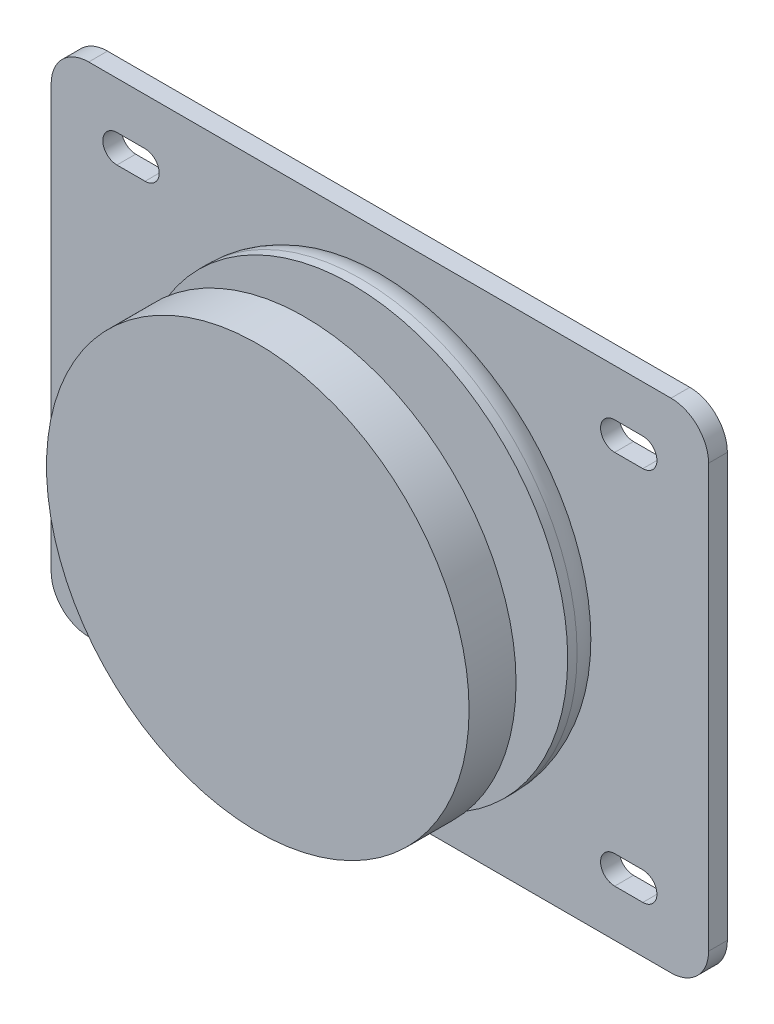
ISO-10303-21;
HEADER;
FILE_DESCRIPTION(('STEP AP214'),'2;1');
FILE_NAME('part.step','',(''),(''),'','','');
FILE_SCHEMA(('AUTOMOTIVE_DESIGN { 1 0 10303 214 1 1 1 1 }'));
ENDSEC;
DATA;
#1=APPLICATION_CONTEXT('core data for automotive mechanical design processes');
#2=APPLICATION_PROTOCOL_DEFINITION('international standard','automotive_design',2000,#1);
#3=PRODUCT_CONTEXT('',#1,'mechanical');
#4=PRODUCT('Part','Part','',(#3));
#5=PRODUCT_RELATED_PRODUCT_CATEGORY('part','',(#4));
#6=PRODUCT_DEFINITION_FORMATION('','',#4);
#7=PRODUCT_DEFINITION_CONTEXT('part definition',#1,'design');
#8=PRODUCT_DEFINITION('design','',#6,#7);
#9=PRODUCT_DEFINITION_SHAPE('','',#8);
#10=(LENGTH_UNIT() NAMED_UNIT(*) SI_UNIT(.MILLI.,.METRE.));
#11=(NAMED_UNIT(*) PLANE_ANGLE_UNIT() SI_UNIT($,.RADIAN.));
#12=(NAMED_UNIT(*) SI_UNIT($,.STERADIAN.) SOLID_ANGLE_UNIT());
#13=UNCERTAINTY_MEASURE_WITH_UNIT(LENGTH_MEASURE(1.E-05),#10,'distance_accuracy_value','');
#14=(GEOMETRIC_REPRESENTATION_CONTEXT(3) GLOBAL_UNCERTAINTY_ASSIGNED_CONTEXT((#13)) GLOBAL_UNIT_ASSIGNED_CONTEXT((#10,
#11,#12)) REPRESENTATION_CONTEXT('',''));
#15=CARTESIAN_POINT('',(0.,0.,0.));
#16=DIRECTION('',(0.,0.,1.));
#17=DIRECTION('',(1.,0.,0.));
#18=AXIS2_PLACEMENT_3D('',#15,#16,#17);
#19=CARTESIAN_POINT('',(0.,0.,5.));
#20=DIRECTION('',(0.,0.,1.));
#21=DIRECTION('',(1.,0.,0.));
#22=AXIS2_PLACEMENT_3D('',#19,#20,#21);
#23=PLANE('',#22);
#24=CARTESIAN_POINT('',(0.,0.,5.));
#25=DIRECTION('',(0.,0.,1.));
#26=DIRECTION('',(1.,0.,0.));
#27=AXIS2_PLACEMENT_3D('',#24,#25,#26);
#28=CIRCLE('',#27,23.);
#29=CARTESIAN_POINT('',(23.,0.,5.));
#30=VERTEX_POINT('',#29);
#31=EDGE_CURVE('E46',#30,#30,#28,.T.);
#32=ORIENTED_EDGE('',*,*,#31,.T.);
#33=EDGE_LOOP('',(#32));
#34=FACE_BOUND('',#33,.T.);
#35=CARTESIAN_POINT('',(0.,0.,5.));
#36=DIRECTION('',(0.,0.,1.));
#37=DIRECTION('',(1.,0.,0.));
#38=AXIS2_PLACEMENT_3D('',#35,#36,#37);
#39=CIRCLE('',#38,14.);
#40=CARTESIAN_POINT('',(14.,0.,5.));
#41=VERTEX_POINT('',#40);
#42=EDGE_CURVE('E551',#41,#41,#39,.T.);
#43=ORIENTED_EDGE('',*,*,#42,.F.);
#44=EDGE_LOOP('',(#43));
#45=FACE_BOUND('',#44,.T.);
#46=ADVANCED_FACE('F37',(#34,#45),#23,.T.);
#47=CARTESIAN_POINT('',(0.,0.,4.));
#48=DIRECTION('',(0.,0.,1.));
#49=DIRECTION('',(1.,0.,0.));
#50=AXIS2_PLACEMENT_3D('',#47,#48,#49);
#51=TOROIDAL_SURFACE('',#50,19.,4.);
#52=CARTESIAN_POINT('',(0.,0.,4.));
#53=DIRECTION('',(0.,0.,1.));
#54=DIRECTION('',(1.,0.,0.));
#55=AXIS2_PLACEMENT_3D('',#52,#53,#54);
#56=CIRCLE('',#55,23.);
#57=CARTESIAN_POINT('',(23.,0.,4.));
#58=VERTEX_POINT('',#57);
#59=EDGE_CURVE('E11',#58,#58,#56,.T.);
#60=ORIENTED_EDGE('',*,*,#59,.F.);
#61=EDGE_LOOP('',(#60));
#62=FACE_BOUND('',#61,.T.);
#63=CARTESIAN_POINT('',(0.,0.,2.));
#64=DIRECTION('',(0.,0.,-1.));
#65=DIRECTION('',(-1.,0.,0.));
#66=AXIS2_PLACEMENT_3D('',#63,#64,#65);
#67=CIRCLE('',#66,22.4641016151378);
#68=CARTESIAN_POINT('',(-22.4641016151378,0.,2.));
#69=VERTEX_POINT('',#68);
#70=EDGE_CURVE('E41',#69,#69,#67,.F.);
#71=ORIENTED_EDGE('',*,*,#70,.T.);
#72=EDGE_LOOP('',(#71));
#73=FACE_BOUND('',#72,.T.);
#74=ADVANCED_FACE('F39',(#62,#73),#51,.T.);
#75=CARTESIAN_POINT('',(0.,0.,5.));
#76=DIRECTION('',(0.,0.,-1.));
#77=DIRECTION('',(-1.,0.,0.));
#78=AXIS2_PLACEMENT_3D('',#75,#76,#77);
#79=CYLINDRICAL_SURFACE('',#78,23.);
#80=ORIENTED_EDGE('',*,*,#59,.T.);
#81=EDGE_LOOP('',(#80));
#82=FACE_BOUND('',#81,.T.);
#83=ORIENTED_EDGE('',*,*,#31,.F.);
#84=EDGE_LOOP('',(#83));
#85=FACE_BOUND('',#84,.T.);
#86=ADVANCED_FACE('F457',(#82,#85),#79,.T.);
#87=CARTESIAN_POINT('',(31.,22.5,2.));
#88=DIRECTION('',(0.,0.,-1.));
#89=DIRECTION('',(-1.,0.,0.));
#90=AXIS2_PLACEMENT_3D('',#87,#88,#89);
#91=CYLINDRICAL_SURFACE('',#90,4.);
#92=CARTESIAN_POINT('',(31.,22.5,0.));
#93=DIRECTION('',(0.,0.,1.));
#94=DIRECTION('',(-1.,0.,0.));
#95=AXIS2_PLACEMENT_3D('',#92,#93,#94);
#96=CIRCLE('',#95,4.);
#97=CARTESIAN_POINT('',(35.,22.5,0.));
#98=VERTEX_POINT('',#97);
#99=CARTESIAN_POINT('',(31.,26.5,0.));
#100=VERTEX_POINT('',#99);
#101=EDGE_CURVE('E332',#98,#100,#96,.T.);
#102=ORIENTED_EDGE('',*,*,#101,.T.);
#103=DIRECTION('',(0.,0.,-1.));
#104=VECTOR('',#103,1.);
#105=CARTESIAN_POINT('',(31.,26.5,2.));
#106=LINE('',#105,#104);
#107=CARTESIAN_POINT('',(31.,26.5,2.));
#108=VERTEX_POINT('',#107);
#109=EDGE_CURVE('E387',#108,#100,#106,.T.);
#110=ORIENTED_EDGE('',*,*,#109,.F.);
#111=CARTESIAN_POINT('',(31.,22.5,2.));
#112=DIRECTION('',(0.,0.,1.));
#113=DIRECTION('',(-1.,0.,0.));
#114=AXIS2_PLACEMENT_3D('',#111,#112,#113);
#115=CIRCLE('',#114,4.);
#116=CARTESIAN_POINT('',(35.,22.5,2.));
#117=VERTEX_POINT('',#116);
#118=EDGE_CURVE('E333',#117,#108,#115,.T.);
#119=ORIENTED_EDGE('',*,*,#118,.F.);
#120=DIRECTION('',(0.,0.,-1.));
#121=VECTOR('',#120,1.);
#122=CARTESIAN_POINT('',(35.,22.5,2.));
#123=LINE('',#122,#121);
#124=EDGE_CURVE('E351',#117,#98,#123,.T.);
#125=ORIENTED_EDGE('',*,*,#124,.T.);
#126=EDGE_LOOP('',(#102,#110,#119,#125));
#127=FACE_BOUND('',#126,.T.);
#128=ADVANCED_FACE('F409',(#127),#91,.T.);
#129=CARTESIAN_POINT('',(-31.,26.5,2.));
#130=DIRECTION('',(0.,-1.,0.));
#131=DIRECTION('',(1.,0.,0.));
#132=AXIS2_PLACEMENT_3D('',#129,#130,#131);
#133=PLANE('',#132);
#134=DIRECTION('',(-1.,0.,0.));
#135=VECTOR('',#134,1.);
#136=CARTESIAN_POINT('',(-31.,26.5,0.));
#137=LINE('',#136,#135);
#138=CARTESIAN_POINT('',(-31.,26.5,0.));
#139=VERTEX_POINT('',#138);
#140=EDGE_CURVE('E354',#100,#139,#137,.T.);
#141=ORIENTED_EDGE('',*,*,#140,.T.);
#142=DIRECTION('',(0.,0.,-1.));
#143=VECTOR('',#142,1.);
#144=CARTESIAN_POINT('',(-31.,26.5,2.));
#145=LINE('',#144,#143);
#146=CARTESIAN_POINT('',(-31.,26.5,2.));
#147=VERTEX_POINT('',#146);
#148=EDGE_CURVE('E384',#147,#139,#145,.T.);
#149=ORIENTED_EDGE('',*,*,#148,.F.);
#150=DIRECTION('',(-1.,0.,0.));
#151=VECTOR('',#150,1.);
#152=CARTESIAN_POINT('',(-31.,26.5,2.));
#153=LINE('',#152,#151);
#154=EDGE_CURVE('E336',#108,#147,#153,.T.);
#155=ORIENTED_EDGE('',*,*,#154,.F.);
#156=ORIENTED_EDGE('',*,*,#109,.T.);
#157=EDGE_LOOP('',(#141,#149,#155,#156));
#158=FACE_BOUND('',#157,.T.);
#159=ADVANCED_FACE('F412',(#158),#133,.F.);
#160=CARTESIAN_POINT('',(-31.,22.5,2.));
#161=DIRECTION('',(0.,0.,-1.));
#162=DIRECTION('',(-1.,0.,0.));
#163=AXIS2_PLACEMENT_3D('',#160,#161,#162);
#164=CYLINDRICAL_SURFACE('',#163,4.);
#165=CARTESIAN_POINT('',(-31.,22.5,0.));
#166=DIRECTION('',(0.,0.,1.));
#167=DIRECTION('',(-1.,0.,0.));
#168=AXIS2_PLACEMENT_3D('',#165,#166,#167);
#169=CIRCLE('',#168,4.);
#170=CARTESIAN_POINT('',(-35.,22.5,0.));
#171=VERTEX_POINT('',#170);
#172=EDGE_CURVE('E356',#139,#171,#169,.T.);
#173=ORIENTED_EDGE('',*,*,#172,.T.);
#174=DIRECTION('',(0.,0.,-1.));
#175=VECTOR('',#174,1.);
#176=CARTESIAN_POINT('',(-35.,22.5,2.));
#177=LINE('',#176,#175);
#178=CARTESIAN_POINT('',(-35.,22.5,2.));
#179=VERTEX_POINT('',#178);
#180=EDGE_CURVE('E381',#179,#171,#177,.T.);
#181=ORIENTED_EDGE('',*,*,#180,.F.);
#182=CARTESIAN_POINT('',(-31.,22.5,2.));
#183=DIRECTION('',(0.,0.,1.));
#184=DIRECTION('',(-1.,0.,0.));
#185=AXIS2_PLACEMENT_3D('',#182,#183,#184);
#186=CIRCLE('',#185,4.);
#187=EDGE_CURVE('E339',#147,#179,#186,.T.);
#188=ORIENTED_EDGE('',*,*,#187,.F.);
#189=ORIENTED_EDGE('',*,*,#148,.T.);
#190=EDGE_LOOP('',(#173,#181,#188,#189));
#191=FACE_BOUND('',#190,.T.);
#192=ADVANCED_FACE('F417',(#191),#164,.T.);
#193=CARTESIAN_POINT('',(-35.,-22.5,2.));
#194=DIRECTION('',(1.,0.,0.));
#195=DIRECTION('',(0.,0.,-1.));
#196=AXIS2_PLACEMENT_3D('',#193,#194,#195);
#197=PLANE('',#196);
#198=DIRECTION('',(0.,-1.,0.));
#199=VECTOR('',#198,1.);
#200=CARTESIAN_POINT('',(-35.,-22.5,0.));
#201=LINE('',#200,#199);
#202=CARTESIAN_POINT('',(-35.,-22.5,0.));
#203=VERTEX_POINT('',#202);
#204=EDGE_CURVE('E358',#171,#203,#201,.T.);
#205=ORIENTED_EDGE('',*,*,#204,.T.);
#206=DIRECTION('',(0.,0.,-1.));
#207=VECTOR('',#206,1.);
#208=CARTESIAN_POINT('',(-35.,-22.5,2.));
#209=LINE('',#208,#207);
#210=CARTESIAN_POINT('',(-35.,-22.5,2.));
#211=VERTEX_POINT('',#210);
#212=EDGE_CURVE('E378',#211,#203,#209,.T.);
#213=ORIENTED_EDGE('',*,*,#212,.F.);
#214=DIRECTION('',(0.,-1.,0.));
#215=VECTOR('',#214,1.);
#216=CARTESIAN_POINT('',(-35.,-22.5,2.));
#217=LINE('',#216,#215);
#218=EDGE_CURVE('E341',#179,#211,#217,.T.);
#219=ORIENTED_EDGE('',*,*,#218,.F.);
#220=ORIENTED_EDGE('',*,*,#180,.T.);
#221=EDGE_LOOP('',(#205,#213,#219,#220));
#222=FACE_BOUND('',#221,.T.);
#223=ADVANCED_FACE('F423',(#222),#197,.F.);
#224=CARTESIAN_POINT('',(-31.,-22.5,2.));
#225=DIRECTION('',(0.,0.,-1.));
#226=DIRECTION('',(-1.,0.,0.));
#227=AXIS2_PLACEMENT_3D('',#224,#225,#226);
#228=CYLINDRICAL_SURFACE('',#227,4.);
#229=CARTESIAN_POINT('',(-31.,-22.5,0.));
#230=DIRECTION('',(0.,0.,1.));
#231=DIRECTION('',(-1.,0.,0.));
#232=AXIS2_PLACEMENT_3D('',#229,#230,#231);
#233=CIRCLE('',#232,4.);
#234=CARTESIAN_POINT('',(-31.,-26.5,0.));
#235=VERTEX_POINT('',#234);
#236=EDGE_CURVE('E360',#203,#235,#233,.T.);
#237=ORIENTED_EDGE('',*,*,#236,.T.);
#238=DIRECTION('',(0.,0.,-1.));
#239=VECTOR('',#238,1.);
#240=CARTESIAN_POINT('',(-31.,-26.5,2.));
#241=LINE('',#240,#239);
#242=CARTESIAN_POINT('',(-31.,-26.5,2.));
#243=VERTEX_POINT('',#242);
#244=EDGE_CURVE('E375',#243,#235,#241,.T.);
#245=ORIENTED_EDGE('',*,*,#244,.F.);
#246=CARTESIAN_POINT('',(-31.,-22.5,2.));
#247=DIRECTION('',(0.,0.,1.));
#248=DIRECTION('',(-1.,0.,0.));
#249=AXIS2_PLACEMENT_3D('',#246,#247,#248);
#250=CIRCLE('',#249,4.);
#251=EDGE_CURVE('E343',#211,#243,#250,.T.);
#252=ORIENTED_EDGE('',*,*,#251,.F.);
#253=ORIENTED_EDGE('',*,*,#212,.T.);
#254=EDGE_LOOP('',(#237,#245,#252,#253));
#255=FACE_BOUND('',#254,.T.);
#256=ADVANCED_FACE('F427',(#255),#228,.T.);
#257=CARTESIAN_POINT('',(-31.,-26.5,2.));
#258=DIRECTION('',(0.,1.,0.));
#259=DIRECTION('',(0.,0.,1.));
#260=AXIS2_PLACEMENT_3D('',#257,#258,#259);
#261=PLANE('',#260);
#262=DIRECTION('',(1.,0.,0.));
#263=VECTOR('',#262,1.);
#264=CARTESIAN_POINT('',(-31.,-26.5,0.));
#265=LINE('',#264,#263);
#266=CARTESIAN_POINT('',(31.,-26.5,0.));
#267=VERTEX_POINT('',#266);
#268=EDGE_CURVE('E362',#235,#267,#265,.T.);
#269=ORIENTED_EDGE('',*,*,#268,.T.);
#270=DIRECTION('',(0.,0.,-1.));
#271=VECTOR('',#270,1.);
#272=CARTESIAN_POINT('',(31.,-26.5,2.));
#273=LINE('',#272,#271);
#274=CARTESIAN_POINT('',(31.,-26.5,2.));
#275=VERTEX_POINT('',#274);
#276=EDGE_CURVE('E372',#275,#267,#273,.T.);
#277=ORIENTED_EDGE('',*,*,#276,.F.);
#278=DIRECTION('',(1.,0.,0.));
#279=VECTOR('',#278,1.);
#280=CARTESIAN_POINT('',(-31.,-26.5,2.));
#281=LINE('',#280,#279);
#282=EDGE_CURVE('E345',#243,#275,#281,.T.);
#283=ORIENTED_EDGE('',*,*,#282,.F.);
#284=ORIENTED_EDGE('',*,*,#244,.T.);
#285=EDGE_LOOP('',(#269,#277,#283,#284));
#286=FACE_BOUND('',#285,.T.);
#287=ADVANCED_FACE('F432',(#286),#261,.F.);
#288=CARTESIAN_POINT('',(31.,-22.5,2.));
#289=DIRECTION('',(0.,0.,-1.));
#290=DIRECTION('',(-1.,0.,0.));
#291=AXIS2_PLACEMENT_3D('',#288,#289,#290);
#292=CYLINDRICAL_SURFACE('',#291,4.);
#293=CARTESIAN_POINT('',(31.,-22.5,0.));
#294=DIRECTION('',(0.,0.,1.));
#295=DIRECTION('',(1.,0.,0.));
#296=AXIS2_PLACEMENT_3D('',#293,#294,#295);
#297=CIRCLE('',#296,4.);
#298=CARTESIAN_POINT('',(35.,-22.5,0.));
#299=VERTEX_POINT('',#298);
#300=EDGE_CURVE('E364',#267,#299,#297,.T.);
#301=ORIENTED_EDGE('',*,*,#300,.T.);
#302=DIRECTION('',(0.,0.,-1.));
#303=VECTOR('',#302,1.);
#304=CARTESIAN_POINT('',(35.,-22.5,2.));
#305=LINE('',#304,#303);
#306=CARTESIAN_POINT('',(35.,-22.5,2.));
#307=VERTEX_POINT('',#306);
#308=EDGE_CURVE('E369',#307,#299,#305,.T.);
#309=ORIENTED_EDGE('',*,*,#308,.F.);
#310=CARTESIAN_POINT('',(31.,-22.5,2.));
#311=DIRECTION('',(0.,0.,1.));
#312=DIRECTION('',(1.,0.,0.));
#313=AXIS2_PLACEMENT_3D('',#310,#311,#312);
#314=CIRCLE('',#313,4.);
#315=EDGE_CURVE('E347',#275,#307,#314,.T.);
#316=ORIENTED_EDGE('',*,*,#315,.F.);
#317=ORIENTED_EDGE('',*,*,#276,.T.);
#318=EDGE_LOOP('',(#301,#309,#316,#317));
#319=FACE_BOUND('',#318,.T.);
#320=ADVANCED_FACE('F436',(#319),#292,.T.);
#321=CARTESIAN_POINT('',(35.,-22.5,2.));
#322=DIRECTION('',(-1.,0.,0.));
#323=DIRECTION('',(0.,-1.,0.));
#324=AXIS2_PLACEMENT_3D('',#321,#322,#323);
#325=PLANE('',#324);
#326=DIRECTION('',(0.,1.,0.));
#327=VECTOR('',#326,1.);
#328=CARTESIAN_POINT('',(35.,-22.5,0.));
#329=LINE('',#328,#327);
#330=EDGE_CURVE('E337',#299,#98,#329,.T.);
#331=ORIENTED_EDGE('',*,*,#330,.T.);
#332=ORIENTED_EDGE('',*,*,#124,.F.);
#333=DIRECTION('',(0.,1.,0.));
#334=VECTOR('',#333,1.);
#335=CARTESIAN_POINT('',(35.,-22.5,2.));
#336=LINE('',#335,#334);
#337=EDGE_CURVE('E349',#307,#117,#336,.T.);
#338=ORIENTED_EDGE('',*,*,#337,.F.);
#339=ORIENTED_EDGE('',*,*,#308,.T.);
#340=EDGE_LOOP('',(#331,#332,#338,#339));
#341=FACE_BOUND('',#340,.T.);
#342=ADVANCED_FACE('F400',(#341),#325,.F.);
#343=CARTESIAN_POINT('',(31.,22.5,2.));
#344=DIRECTION('',(0.,0.,-1.));
#345=DIRECTION('',(-1.,0.,0.));
#346=AXIS2_PLACEMENT_3D('',#343,#344,#345);
#347=PLANE('',#346);
#348=DIRECTION('',(-1.,0.,0.));
#349=VECTOR('',#348,1.);
#350=CARTESIAN_POINT('',(31.,18.5,2.));
#351=LINE('',#350,#349);
#352=CARTESIAN_POINT('',(28.,18.5,2.));
#353=VERTEX_POINT('',#352);
#354=CARTESIAN_POINT('',(25.,18.5,2.));
#355=VERTEX_POINT('',#354);
#356=EDGE_CURVE('E230',#353,#355,#351,.T.);
#357=ORIENTED_EDGE('',*,*,#356,.T.);
#358=CARTESIAN_POINT('',(25.,20.,2.));
#359=DIRECTION('',(0.,0.,-1.));
#360=DIRECTION('',(-1.,0.,0.));
#361=AXIS2_PLACEMENT_3D('',#358,#359,#360);
#362=CIRCLE('',#361,1.5);
#363=CARTESIAN_POINT('',(25.,21.5,2.));
#364=VERTEX_POINT('',#363);
#365=EDGE_CURVE('E233',#355,#364,#362,.T.);
#366=ORIENTED_EDGE('',*,*,#365,.T.);
#367=DIRECTION('',(1.,0.,0.));
#368=VECTOR('',#367,1.);
#369=CARTESIAN_POINT('',(31.,21.5,2.));
#370=LINE('',#369,#368);
#371=CARTESIAN_POINT('',(28.,21.5,2.));
#372=VERTEX_POINT('',#371);
#373=EDGE_CURVE('E225',#364,#372,#370,.T.);
#374=ORIENTED_EDGE('',*,*,#373,.T.);
#375=CARTESIAN_POINT('',(28.,20.,2.));
#376=DIRECTION('',(0.,0.,-1.));
#377=DIRECTION('',(-1.,0.,0.));
#378=AXIS2_PLACEMENT_3D('',#375,#376,#377);
#379=CIRCLE('',#378,1.5);
#380=EDGE_CURVE('E205',#372,#353,#379,.T.);
#381=ORIENTED_EDGE('',*,*,#380,.T.);
#382=EDGE_LOOP('',(#357,#366,#374,#381));
#383=FACE_BOUND('',#382,.T.);
#384=DIRECTION('',(1.,0.,0.));
#385=VECTOR('',#384,1.);
#386=CARTESIAN_POINT('',(31.,-18.5,2.));
#387=LINE('',#386,#385);
#388=CARTESIAN_POINT('',(25.,-18.5,2.));
#389=VERTEX_POINT('',#388);
#390=CARTESIAN_POINT('',(28.,-18.5,2.));
#391=VERTEX_POINT('',#390);
#392=EDGE_CURVE('E262',#389,#391,#387,.T.);
#393=ORIENTED_EDGE('',*,*,#392,.T.);
#394=CARTESIAN_POINT('',(28.,-20.,2.));
#395=DIRECTION('',(0.,0.,-1.));
#396=DIRECTION('',(-1.,0.,0.));
#397=AXIS2_PLACEMENT_3D('',#394,#395,#396);
#398=CIRCLE('',#397,1.5);
#399=CARTESIAN_POINT('',(28.,-21.5,2.));
#400=VERTEX_POINT('',#399);
#401=EDGE_CURVE('E265',#391,#400,#398,.T.);
#402=ORIENTED_EDGE('',*,*,#401,.T.);
#403=DIRECTION('',(-1.,0.,0.));
#404=VECTOR('',#403,1.);
#405=CARTESIAN_POINT('',(31.,-21.5,2.));
#406=LINE('',#405,#404);
#407=CARTESIAN_POINT('',(25.,-21.5,2.));
#408=VERTEX_POINT('',#407);
#409=EDGE_CURVE('E250',#400,#408,#406,.T.);
#410=ORIENTED_EDGE('',*,*,#409,.T.);
#411=CARTESIAN_POINT('',(25.,-20.,2.));
#412=DIRECTION('',(0.,0.,-1.));
#413=DIRECTION('',(-1.,0.,0.));
#414=AXIS2_PLACEMENT_3D('',#411,#412,#413);
#415=CIRCLE('',#414,1.5);
#416=EDGE_CURVE('E259',#408,#389,#415,.T.);
#417=ORIENTED_EDGE('',*,*,#416,.T.);
#418=EDGE_LOOP('',(#393,#402,#410,#417));
#419=FACE_BOUND('',#418,.T.);
#420=DIRECTION('',(-1.,0.,0.));
#421=VECTOR('',#420,1.);
#422=CARTESIAN_POINT('',(31.,-21.5,2.));
#423=LINE('',#422,#421);
#424=CARTESIAN_POINT('',(-25.,-21.5,2.));
#425=VERTEX_POINT('',#424);
#426=CARTESIAN_POINT('',(-28.,-21.5,2.));
#427=VERTEX_POINT('',#426);
#428=EDGE_CURVE('E294',#425,#427,#423,.T.);
#429=ORIENTED_EDGE('',*,*,#428,.T.);
#430=CARTESIAN_POINT('',(-28.,-20.,2.));
#431=DIRECTION('',(0.,0.,-1.));
#432=DIRECTION('',(-1.,0.,0.));
#433=AXIS2_PLACEMENT_3D('',#430,#431,#432);
#434=CIRCLE('',#433,1.5);
#435=CARTESIAN_POINT('',(-28.,-18.5,2.));
#436=VERTEX_POINT('',#435);
#437=EDGE_CURVE('E297',#427,#436,#434,.T.);
#438=ORIENTED_EDGE('',*,*,#437,.T.);
#439=DIRECTION('',(1.,0.,0.));
#440=VECTOR('',#439,1.);
#441=CARTESIAN_POINT('',(31.,-18.5,2.));
#442=LINE('',#441,#440);
#443=CARTESIAN_POINT('',(-25.,-18.5,2.));
#444=VERTEX_POINT('',#443);
#445=EDGE_CURVE('E282',#436,#444,#442,.T.);
#446=ORIENTED_EDGE('',*,*,#445,.T.);
#447=CARTESIAN_POINT('',(-25.,-20.,2.));
#448=DIRECTION('',(0.,0.,-1.));
#449=DIRECTION('',(-1.,0.,0.));
#450=AXIS2_PLACEMENT_3D('',#447,#448,#449);
#451=CIRCLE('',#450,1.5);
#452=EDGE_CURVE('E291',#444,#425,#451,.T.);
#453=ORIENTED_EDGE('',*,*,#452,.T.);
#454=EDGE_LOOP('',(#429,#438,#446,#453));
#455=FACE_BOUND('',#454,.T.);
#456=DIRECTION('',(1.,0.,0.));
#457=VECTOR('',#456,1.);
#458=CARTESIAN_POINT('',(31.,21.5,2.));
#459=LINE('',#458,#457);
#460=CARTESIAN_POINT('',(-28.,21.5,2.));
#461=VERTEX_POINT('',#460);
#462=CARTESIAN_POINT('',(-25.,21.5,2.));
#463=VERTEX_POINT('',#462);
#464=EDGE_CURVE('E326',#461,#463,#459,.T.);
#465=ORIENTED_EDGE('',*,*,#464,.T.);
#466=CARTESIAN_POINT('',(-25.,20.,2.));
#467=DIRECTION('',(0.,0.,-1.));
#468=DIRECTION('',(-1.,0.,0.));
#469=AXIS2_PLACEMENT_3D('',#466,#467,#468);
#470=CIRCLE('',#469,1.5);
#471=CARTESIAN_POINT('',(-25.,18.5,2.));
#472=VERTEX_POINT('',#471);
#473=EDGE_CURVE('E329',#463,#472,#470,.T.);
#474=ORIENTED_EDGE('',*,*,#473,.T.);
#475=DIRECTION('',(-1.,0.,0.));
#476=VECTOR('',#475,1.);
#477=CARTESIAN_POINT('',(31.,18.5,2.));
#478=LINE('',#477,#476);
#479=CARTESIAN_POINT('',(-28.,18.5,2.));
#480=VERTEX_POINT('',#479);
#481=EDGE_CURVE('E314',#472,#480,#478,.T.);
#482=ORIENTED_EDGE('',*,*,#481,.T.);
#483=CARTESIAN_POINT('',(-28.,20.,2.));
#484=DIRECTION('',(0.,0.,-1.));
#485=DIRECTION('',(-1.,0.,0.));
#486=AXIS2_PLACEMENT_3D('',#483,#484,#485);
#487=CIRCLE('',#486,1.5);
#488=EDGE_CURVE('E323',#480,#461,#487,.T.);
#489=ORIENTED_EDGE('',*,*,#488,.T.);
#490=EDGE_LOOP('',(#465,#474,#482,#489));
#491=FACE_BOUND('',#490,.T.);
#492=ORIENTED_EDGE('',*,*,#70,.F.);
#493=EDGE_LOOP('',(#492));
#494=FACE_BOUND('',#493,.T.);
#495=ORIENTED_EDGE('',*,*,#118,.T.);
#496=ORIENTED_EDGE('',*,*,#154,.T.);
#497=ORIENTED_EDGE('',*,*,#187,.T.);
#498=ORIENTED_EDGE('',*,*,#218,.T.);
#499=ORIENTED_EDGE('',*,*,#251,.T.);
#500=ORIENTED_EDGE('',*,*,#282,.T.);
#501=ORIENTED_EDGE('',*,*,#315,.T.);
#502=ORIENTED_EDGE('',*,*,#337,.T.);
#503=EDGE_LOOP('',(#495,#496,#497,#498,#499,#500,#501,#502));
#504=FACE_BOUND('',#503,.T.);
#505=ADVANCED_FACE('F397',(#383,#419,#455,#491,#494,#504),#347,.F.);
#506=CARTESIAN_POINT('',(0.,0.,0.));
#507=DIRECTION('',(0.,0.,1.));
#508=DIRECTION('',(1.,0.,0.));
#509=AXIS2_PLACEMENT_3D('',#506,#507,#508);
#510=PLANE('',#509);
#511=DIRECTION('',(1.,0.,0.));
#512=VECTOR('',#511,1.);
#513=CARTESIAN_POINT('',(28.,21.5,0.));
#514=LINE('',#513,#512);
#515=CARTESIAN_POINT('',(25.,21.5,0.));
#516=VERTEX_POINT('',#515);
#517=CARTESIAN_POINT('',(28.,21.5,0.));
#518=VERTEX_POINT('',#517);
#519=EDGE_CURVE('E211',#516,#518,#514,.T.);
#520=ORIENTED_EDGE('',*,*,#519,.F.);
#521=CARTESIAN_POINT('',(25.,20.,0.));
#522=DIRECTION('',(0.,0.,-1.));
#523=DIRECTION('',(1.,0.,0.));
#524=AXIS2_PLACEMENT_3D('',#521,#522,#523);
#525=CIRCLE('',#524,1.5);
#526=CARTESIAN_POINT('',(25.,18.5,0.));
#527=VERTEX_POINT('',#526);
#528=EDGE_CURVE('E61',#527,#516,#525,.T.);
#529=ORIENTED_EDGE('',*,*,#528,.F.);
#530=DIRECTION('',(-1.,0.,0.));
#531=VECTOR('',#530,1.);
#532=CARTESIAN_POINT('',(25.,18.5,0.));
#533=LINE('',#532,#531);
#534=CARTESIAN_POINT('',(28.,18.5,0.));
#535=VERTEX_POINT('',#534);
#536=EDGE_CURVE('E218',#535,#527,#533,.T.);
#537=ORIENTED_EDGE('',*,*,#536,.F.);
#538=CARTESIAN_POINT('',(28.,20.,0.));
#539=DIRECTION('',(0.,0.,-1.));
#540=DIRECTION('',(1.,0.,0.));
#541=AXIS2_PLACEMENT_3D('',#538,#539,#540);
#542=CIRCLE('',#541,1.5);
#543=EDGE_CURVE('E202',#518,#535,#542,.T.);
#544=ORIENTED_EDGE('',*,*,#543,.F.);
#545=EDGE_LOOP('',(#520,#529,#537,#544));
#546=FACE_BOUND('',#545,.T.);
#547=DIRECTION('',(-1.,0.,0.));
#548=VECTOR('',#547,1.);
#549=CARTESIAN_POINT('',(28.,-21.5,0.));
#550=LINE('',#549,#548);
#551=CARTESIAN_POINT('',(28.,-21.5,0.));
#552=VERTEX_POINT('',#551);
#553=CARTESIAN_POINT('',(25.,-21.5,0.));
#554=VERTEX_POINT('',#553);
#555=EDGE_CURVE('E238',#552,#554,#550,.T.);
#556=ORIENTED_EDGE('',*,*,#555,.F.);
#557=CARTESIAN_POINT('',(28.,-20.,0.));
#558=DIRECTION('',(0.,0.,-1.));
#559=DIRECTION('',(-1.,0.,0.));
#560=AXIS2_PLACEMENT_3D('',#557,#558,#559);
#561=CIRCLE('',#560,1.5);
#562=CARTESIAN_POINT('',(28.,-18.5,0.));
#563=VERTEX_POINT('',#562);
#564=EDGE_CURVE('E236',#563,#552,#561,.T.);
#565=ORIENTED_EDGE('',*,*,#564,.F.);
#566=DIRECTION('',(1.,0.,0.));
#567=VECTOR('',#566,1.);
#568=CARTESIAN_POINT('',(25.,-18.5,0.));
#569=LINE('',#568,#567);
#570=CARTESIAN_POINT('',(25.,-18.5,0.));
#571=VERTEX_POINT('',#570);
#572=EDGE_CURVE('E244',#571,#563,#569,.T.);
#573=ORIENTED_EDGE('',*,*,#572,.F.);
#574=CARTESIAN_POINT('',(25.,-20.,0.));
#575=DIRECTION('',(0.,0.,-1.));
#576=DIRECTION('',(-1.,0.,0.));
#577=AXIS2_PLACEMENT_3D('',#574,#575,#576);
#578=CIRCLE('',#577,1.5);
#579=EDGE_CURVE('E241',#554,#571,#578,.T.);
#580=ORIENTED_EDGE('',*,*,#579,.F.);
#581=EDGE_LOOP('',(#556,#565,#573,#580));
#582=FACE_BOUND('',#581,.T.);
#583=DIRECTION('',(1.,0.,0.));
#584=VECTOR('',#583,1.);
#585=CARTESIAN_POINT('',(-25.,-18.5,0.));
#586=LINE('',#585,#584);
#587=CARTESIAN_POINT('',(-28.,-18.5,0.));
#588=VERTEX_POINT('',#587);
#589=CARTESIAN_POINT('',(-25.,-18.5,0.));
#590=VERTEX_POINT('',#589);
#591=EDGE_CURVE('E270',#588,#590,#586,.T.);
#592=ORIENTED_EDGE('',*,*,#591,.F.);
#593=CARTESIAN_POINT('',(-28.,-20.,0.));
#594=DIRECTION('',(0.,0.,-1.));
#595=DIRECTION('',(1.,0.,0.));
#596=AXIS2_PLACEMENT_3D('',#593,#594,#595);
#597=CIRCLE('',#596,1.5);
#598=CARTESIAN_POINT('',(-28.,-21.5,0.));
#599=VERTEX_POINT('',#598);
#600=EDGE_CURVE('E268',#599,#588,#597,.T.);
#601=ORIENTED_EDGE('',*,*,#600,.F.);
#602=DIRECTION('',(-1.,0.,0.));
#603=VECTOR('',#602,1.);
#604=CARTESIAN_POINT('',(-28.,-21.5,0.));
#605=LINE('',#604,#603);
#606=CARTESIAN_POINT('',(-25.,-21.5,0.));
#607=VERTEX_POINT('',#606);
#608=EDGE_CURVE('E276',#607,#599,#605,.T.);
#609=ORIENTED_EDGE('',*,*,#608,.F.);
#610=CARTESIAN_POINT('',(-25.,-20.,0.));
#611=DIRECTION('',(0.,0.,-1.));
#612=DIRECTION('',(1.,0.,0.));
#613=AXIS2_PLACEMENT_3D('',#610,#611,#612);
#614=CIRCLE('',#613,1.5);
#615=EDGE_CURVE('E273',#590,#607,#614,.T.);
#616=ORIENTED_EDGE('',*,*,#615,.F.);
#617=EDGE_LOOP('',(#592,#601,#609,#616));
#618=FACE_BOUND('',#617,.T.);
#619=DIRECTION('',(-1.,0.,0.));
#620=VECTOR('',#619,1.);
#621=CARTESIAN_POINT('',(-25.,18.5,0.));
#622=LINE('',#621,#620);
#623=CARTESIAN_POINT('',(-25.,18.5,0.));
#624=VERTEX_POINT('',#623);
#625=CARTESIAN_POINT('',(-28.,18.5,0.));
#626=VERTEX_POINT('',#625);
#627=EDGE_CURVE('E302',#624,#626,#622,.T.);
#628=ORIENTED_EDGE('',*,*,#627,.F.);
#629=CARTESIAN_POINT('',(-25.,20.,0.));
#630=DIRECTION('',(0.,0.,-1.));
#631=DIRECTION('',(-1.,0.,0.));
#632=AXIS2_PLACEMENT_3D('',#629,#630,#631);
#633=CIRCLE('',#632,1.5);
#634=CARTESIAN_POINT('',(-25.,21.5,0.));
#635=VERTEX_POINT('',#634);
#636=EDGE_CURVE('E300',#635,#624,#633,.T.);
#637=ORIENTED_EDGE('',*,*,#636,.F.);
#638=DIRECTION('',(1.,0.,0.));
#639=VECTOR('',#638,1.);
#640=CARTESIAN_POINT('',(-28.,21.5,0.));
#641=LINE('',#640,#639);
#642=CARTESIAN_POINT('',(-28.,21.5,0.));
#643=VERTEX_POINT('',#642);
#644=EDGE_CURVE('E308',#643,#635,#641,.T.);
#645=ORIENTED_EDGE('',*,*,#644,.F.);
#646=CARTESIAN_POINT('',(-28.,20.,0.));
#647=DIRECTION('',(0.,0.,-1.));
#648=DIRECTION('',(-1.,0.,0.));
#649=AXIS2_PLACEMENT_3D('',#646,#647,#648);
#650=CIRCLE('',#649,1.5);
#651=EDGE_CURVE('E305',#626,#643,#650,.T.);
#652=ORIENTED_EDGE('',*,*,#651,.F.);
#653=EDGE_LOOP('',(#628,#637,#645,#652));
#654=FACE_BOUND('',#653,.T.);
#655=ORIENTED_EDGE('',*,*,#101,.F.);
#656=ORIENTED_EDGE('',*,*,#330,.F.);
#657=ORIENTED_EDGE('',*,*,#300,.F.);
#658=ORIENTED_EDGE('',*,*,#268,.F.);
#659=ORIENTED_EDGE('',*,*,#236,.F.);
#660=ORIENTED_EDGE('',*,*,#204,.F.);
#661=ORIENTED_EDGE('',*,*,#172,.F.);
#662=ORIENTED_EDGE('',*,*,#140,.F.);
#663=EDGE_LOOP('',(#655,#656,#657,#658,#659,#660,#661,#662));
#664=FACE_BOUND('',#663,.T.);
#665=ADVANCED_FACE('F215',(#546,#582,#618,#654,#664),#510,.F.);
#666=CARTESIAN_POINT('',(-25.,20.,5.));
#667=DIRECTION('',(0.,0.,-1.));
#668=DIRECTION('',(-1.,0.,0.));
#669=AXIS2_PLACEMENT_3D('',#666,#667,#668);
#670=CYLINDRICAL_SURFACE('',#669,1.5);
#671=DIRECTION('',(0.,0.,-1.));
#672=VECTOR('',#671,1.);
#673=CARTESIAN_POINT('',(-25.,21.5,5.));
#674=LINE('',#673,#672);
#675=EDGE_CURVE('E312',#463,#635,#674,.T.);
#676=ORIENTED_EDGE('',*,*,#675,.T.);
#677=ORIENTED_EDGE('',*,*,#636,.T.);
#678=DIRECTION('',(0.,0.,-1.));
#679=VECTOR('',#678,1.);
#680=CARTESIAN_POINT('',(-25.,18.5,5.));
#681=LINE('',#680,#679);
#682=EDGE_CURVE('E311',#472,#624,#681,.T.);
#683=ORIENTED_EDGE('',*,*,#682,.F.);
#684=ORIENTED_EDGE('',*,*,#473,.F.);
#685=EDGE_LOOP('',(#676,#677,#683,#684));
#686=FACE_BOUND('',#685,.T.);
#687=ADVANCED_FACE('F442',(#686),#670,.F.);
#688=CARTESIAN_POINT('',(-28.,21.5,5.));
#689=DIRECTION('',(0.,1.,0.));
#690=DIRECTION('',(0.,0.,1.));
#691=AXIS2_PLACEMENT_3D('',#688,#689,#690);
#692=PLANE('',#691);
#693=DIRECTION('',(0.,0.,-1.));
#694=VECTOR('',#693,1.);
#695=CARTESIAN_POINT('',(-28.,21.5,5.));
#696=LINE('',#695,#694);
#697=EDGE_CURVE('E315',#461,#643,#696,.T.);
#698=ORIENTED_EDGE('',*,*,#697,.T.);
#699=ORIENTED_EDGE('',*,*,#644,.T.);
#700=ORIENTED_EDGE('',*,*,#675,.F.);
#701=ORIENTED_EDGE('',*,*,#464,.F.);
#702=EDGE_LOOP('',(#698,#699,#700,#701));
#703=FACE_BOUND('',#702,.T.);
#704=ADVANCED_FACE('F447',(#703),#692,.F.);
#705=CARTESIAN_POINT('',(-28.,20.,5.));
#706=DIRECTION('',(0.,0.,-1.));
#707=DIRECTION('',(-1.,0.,0.));
#708=AXIS2_PLACEMENT_3D('',#705,#706,#707);
#709=CYLINDRICAL_SURFACE('',#708,1.5);
#710=DIRECTION('',(0.,0.,-1.));
#711=VECTOR('',#710,1.);
#712=CARTESIAN_POINT('',(-28.,18.5,5.));
#713=LINE('',#712,#711);
#714=EDGE_CURVE('E317',#480,#626,#713,.T.);
#715=ORIENTED_EDGE('',*,*,#714,.T.);
#716=ORIENTED_EDGE('',*,*,#651,.T.);
#717=ORIENTED_EDGE('',*,*,#697,.F.);
#718=ORIENTED_EDGE('',*,*,#488,.F.);
#719=EDGE_LOOP('',(#715,#716,#717,#718));
#720=FACE_BOUND('',#719,.T.);
#721=ADVANCED_FACE('F481',(#720),#709,.F.);
#722=CARTESIAN_POINT('',(-25.,18.5,5.));
#723=DIRECTION('',(0.,-1.,0.));
#724=DIRECTION('',(0.,0.,-1.));
#725=AXIS2_PLACEMENT_3D('',#722,#723,#724);
#726=PLANE('',#725);
#727=ORIENTED_EDGE('',*,*,#682,.T.);
#728=ORIENTED_EDGE('',*,*,#627,.T.);
#729=ORIENTED_EDGE('',*,*,#714,.F.);
#730=ORIENTED_EDGE('',*,*,#481,.F.);
#731=EDGE_LOOP('',(#727,#728,#729,#730));
#732=FACE_BOUND('',#731,.T.);
#733=ADVANCED_FACE('F477',(#732),#726,.F.);
#734=CARTESIAN_POINT('',(-28.,-20.,5.));
#735=DIRECTION('',(0.,0.,-1.));
#736=DIRECTION('',(-1.,0.,0.));
#737=AXIS2_PLACEMENT_3D('',#734,#735,#736);
#738=CYLINDRICAL_SURFACE('',#737,1.5);
#739=DIRECTION('',(0.,0.,-1.));
#740=VECTOR('',#739,1.);
#741=CARTESIAN_POINT('',(-28.,-21.5,5.));
#742=LINE('',#741,#740);
#743=EDGE_CURVE('E280',#427,#599,#742,.T.);
#744=ORIENTED_EDGE('',*,*,#743,.T.);
#745=ORIENTED_EDGE('',*,*,#600,.T.);
#746=DIRECTION('',(0.,0.,-1.));
#747=VECTOR('',#746,1.);
#748=CARTESIAN_POINT('',(-28.,-18.5,5.));
#749=LINE('',#748,#747);
#750=EDGE_CURVE('E279',#436,#588,#749,.T.);
#751=ORIENTED_EDGE('',*,*,#750,.F.);
#752=ORIENTED_EDGE('',*,*,#437,.F.);
#753=EDGE_LOOP('',(#744,#745,#751,#752));
#754=FACE_BOUND('',#753,.T.);
#755=ADVANCED_FACE('F480',(#754),#738,.F.);
#756=CARTESIAN_POINT('',(-28.,-21.5,5.));
#757=DIRECTION('',(0.,-1.,0.));
#758=DIRECTION('',(0.,0.,-1.));
#759=AXIS2_PLACEMENT_3D('',#756,#757,#758);
#760=PLANE('',#759);
#761=DIRECTION('',(0.,0.,-1.));
#762=VECTOR('',#761,1.);
#763=CARTESIAN_POINT('',(-25.,-21.5,5.));
#764=LINE('',#763,#762);
#765=EDGE_CURVE('E283',#425,#607,#764,.T.);
#766=ORIENTED_EDGE('',*,*,#765,.T.);
#767=ORIENTED_EDGE('',*,*,#608,.T.);
#768=ORIENTED_EDGE('',*,*,#743,.F.);
#769=ORIENTED_EDGE('',*,*,#428,.F.);
#770=EDGE_LOOP('',(#766,#767,#768,#769));
#771=FACE_BOUND('',#770,.T.);
#772=ADVANCED_FACE('F491',(#771),#760,.F.);
#773=CARTESIAN_POINT('',(-25.,-20.,5.));
#774=DIRECTION('',(0.,0.,-1.));
#775=DIRECTION('',(-1.,0.,0.));
#776=AXIS2_PLACEMENT_3D('',#773,#774,#775);
#777=CYLINDRICAL_SURFACE('',#776,1.5);
#778=DIRECTION('',(0.,0.,-1.));
#779=VECTOR('',#778,1.);
#780=CARTESIAN_POINT('',(-25.,-18.5,5.));
#781=LINE('',#780,#779);
#782=EDGE_CURVE('E285',#444,#590,#781,.T.);
#783=ORIENTED_EDGE('',*,*,#782,.T.);
#784=ORIENTED_EDGE('',*,*,#615,.T.);
#785=ORIENTED_EDGE('',*,*,#765,.F.);
#786=ORIENTED_EDGE('',*,*,#452,.F.);
#787=EDGE_LOOP('',(#783,#784,#785,#786));
#788=FACE_BOUND('',#787,.T.);
#789=ADVANCED_FACE('F497',(#788),#777,.F.);
#790=CARTESIAN_POINT('',(-25.,-18.5,5.));
#791=DIRECTION('',(0.,1.,0.));
#792=DIRECTION('',(0.,0.,1.));
#793=AXIS2_PLACEMENT_3D('',#790,#791,#792);
#794=PLANE('',#793);
#795=ORIENTED_EDGE('',*,*,#750,.T.);
#796=ORIENTED_EDGE('',*,*,#591,.T.);
#797=ORIENTED_EDGE('',*,*,#782,.F.);
#798=ORIENTED_EDGE('',*,*,#445,.F.);
#799=EDGE_LOOP('',(#795,#796,#797,#798));
#800=FACE_BOUND('',#799,.T.);
#801=ADVANCED_FACE('F493',(#800),#794,.F.);
#802=CARTESIAN_POINT('',(28.,-20.,5.));
#803=DIRECTION('',(0.,0.,-1.));
#804=DIRECTION('',(-1.,0.,0.));
#805=AXIS2_PLACEMENT_3D('',#802,#803,#804);
#806=CYLINDRICAL_SURFACE('',#805,1.5);
#807=DIRECTION('',(0.,0.,-1.));
#808=VECTOR('',#807,1.);
#809=CARTESIAN_POINT('',(28.,-18.5,5.));
#810=LINE('',#809,#808);
#811=EDGE_CURVE('E248',#391,#563,#810,.T.);
#812=ORIENTED_EDGE('',*,*,#811,.T.);
#813=ORIENTED_EDGE('',*,*,#564,.T.);
#814=DIRECTION('',(0.,0.,-1.));
#815=VECTOR('',#814,1.);
#816=CARTESIAN_POINT('',(28.,-21.5,5.));
#817=LINE('',#816,#815);
#818=EDGE_CURVE('E247',#400,#552,#817,.T.);
#819=ORIENTED_EDGE('',*,*,#818,.F.);
#820=ORIENTED_EDGE('',*,*,#401,.F.);
#821=EDGE_LOOP('',(#812,#813,#819,#820));
#822=FACE_BOUND('',#821,.T.);
#823=ADVANCED_FACE('F496',(#822),#806,.F.);
#824=CARTESIAN_POINT('',(25.,-18.5,5.));
#825=DIRECTION('',(0.,1.,0.));
#826=DIRECTION('',(0.,0.,1.));
#827=AXIS2_PLACEMENT_3D('',#824,#825,#826);
#828=PLANE('',#827);
#829=DIRECTION('',(0.,0.,-1.));
#830=VECTOR('',#829,1.);
#831=CARTESIAN_POINT('',(25.,-18.5,5.));
#832=LINE('',#831,#830);
#833=EDGE_CURVE('E251',#389,#571,#832,.T.);
#834=ORIENTED_EDGE('',*,*,#833,.T.);
#835=ORIENTED_EDGE('',*,*,#572,.T.);
#836=ORIENTED_EDGE('',*,*,#811,.F.);
#837=ORIENTED_EDGE('',*,*,#392,.F.);
#838=EDGE_LOOP('',(#834,#835,#836,#837));
#839=FACE_BOUND('',#838,.T.);
#840=ADVANCED_FACE('F507',(#839),#828,.F.);
#841=CARTESIAN_POINT('',(25.,-20.,5.));
#842=DIRECTION('',(0.,0.,-1.));
#843=DIRECTION('',(-1.,0.,0.));
#844=AXIS2_PLACEMENT_3D('',#841,#842,#843);
#845=CYLINDRICAL_SURFACE('',#844,1.5);
#846=DIRECTION('',(0.,0.,-1.));
#847=VECTOR('',#846,1.);
#848=CARTESIAN_POINT('',(25.,-21.5,5.));
#849=LINE('',#848,#847);
#850=EDGE_CURVE('E253',#408,#554,#849,.T.);
#851=ORIENTED_EDGE('',*,*,#850,.T.);
#852=ORIENTED_EDGE('',*,*,#579,.T.);
#853=ORIENTED_EDGE('',*,*,#833,.F.);
#854=ORIENTED_EDGE('',*,*,#416,.F.);
#855=EDGE_LOOP('',(#851,#852,#853,#854));
#856=FACE_BOUND('',#855,.T.);
#857=ADVANCED_FACE('F513',(#856),#845,.F.);
#858=CARTESIAN_POINT('',(28.,-21.5,5.));
#859=DIRECTION('',(0.,-1.,0.));
#860=DIRECTION('',(0.,0.,-1.));
#861=AXIS2_PLACEMENT_3D('',#858,#859,#860);
#862=PLANE('',#861);
#863=ORIENTED_EDGE('',*,*,#818,.T.);
#864=ORIENTED_EDGE('',*,*,#555,.T.);
#865=ORIENTED_EDGE('',*,*,#850,.F.);
#866=ORIENTED_EDGE('',*,*,#409,.F.);
#867=EDGE_LOOP('',(#863,#864,#865,#866));
#868=FACE_BOUND('',#867,.T.);
#869=ADVANCED_FACE('F509',(#868),#862,.F.);
#870=CARTESIAN_POINT('',(25.,20.,5.));
#871=DIRECTION('',(0.,0.,-1.));
#872=DIRECTION('',(-1.,0.,0.));
#873=AXIS2_PLACEMENT_3D('',#870,#871,#872);
#874=CYLINDRICAL_SURFACE('',#873,1.5);
#875=DIRECTION('',(0.,0.,-1.));
#876=VECTOR('',#875,1.);
#877=CARTESIAN_POINT('',(25.,18.5,5.));
#878=LINE('',#877,#876);
#879=EDGE_CURVE('E223',#355,#527,#878,.T.);
#880=ORIENTED_EDGE('',*,*,#879,.T.);
#881=ORIENTED_EDGE('',*,*,#528,.T.);
#882=DIRECTION('',(0.,0.,-1.));
#883=VECTOR('',#882,1.);
#884=CARTESIAN_POINT('',(25.,21.5,5.));
#885=LINE('',#884,#883);
#886=EDGE_CURVE('E208',#364,#516,#885,.T.);
#887=ORIENTED_EDGE('',*,*,#886,.F.);
#888=ORIENTED_EDGE('',*,*,#365,.F.);
#889=EDGE_LOOP('',(#880,#881,#887,#888));
#890=FACE_BOUND('',#889,.T.);
#891=ADVANCED_FACE('F512',(#890),#874,.F.);
#892=CARTESIAN_POINT('',(25.,18.5,5.));
#893=DIRECTION('',(0.,-1.,0.));
#894=DIRECTION('',(0.,0.,-1.));
#895=AXIS2_PLACEMENT_3D('',#892,#893,#894);
#896=PLANE('',#895);
#897=DIRECTION('',(0.,0.,-1.));
#898=VECTOR('',#897,1.);
#899=CARTESIAN_POINT('',(28.,18.5,5.));
#900=LINE('',#899,#898);
#901=EDGE_CURVE('E207',#353,#535,#900,.T.);
#902=ORIENTED_EDGE('',*,*,#901,.T.);
#903=ORIENTED_EDGE('',*,*,#536,.T.);
#904=ORIENTED_EDGE('',*,*,#879,.F.);
#905=ORIENTED_EDGE('',*,*,#356,.F.);
#906=EDGE_LOOP('',(#902,#903,#904,#905));
#907=FACE_BOUND('',#906,.T.);
#908=ADVANCED_FACE('F523',(#907),#896,.F.);
#909=CARTESIAN_POINT('',(28.,20.,5.));
#910=DIRECTION('',(0.,0.,-1.));
#911=DIRECTION('',(-1.,0.,0.));
#912=AXIS2_PLACEMENT_3D('',#909,#910,#911);
#913=CYLINDRICAL_SURFACE('',#912,1.5);
#914=DIRECTION('',(0.,0.,-1.));
#915=VECTOR('',#914,1.);
#916=CARTESIAN_POINT('',(28.,21.5,5.));
#917=LINE('',#916,#915);
#918=EDGE_CURVE('E53',#372,#518,#917,.T.);
#919=ORIENTED_EDGE('',*,*,#918,.T.);
#920=ORIENTED_EDGE('',*,*,#543,.T.);
#921=ORIENTED_EDGE('',*,*,#901,.F.);
#922=ORIENTED_EDGE('',*,*,#380,.F.);
#923=EDGE_LOOP('',(#919,#920,#921,#922));
#924=FACE_BOUND('',#923,.T.);
#925=ADVANCED_FACE('F199',(#924),#913,.F.);
#926=CARTESIAN_POINT('',(28.,21.5,5.));
#927=DIRECTION('',(0.,1.,0.));
#928=DIRECTION('',(0.,0.,1.));
#929=AXIS2_PLACEMENT_3D('',#926,#927,#928);
#930=PLANE('',#929);
#931=ORIENTED_EDGE('',*,*,#886,.T.);
#932=ORIENTED_EDGE('',*,*,#519,.T.);
#933=ORIENTED_EDGE('',*,*,#918,.F.);
#934=ORIENTED_EDGE('',*,*,#373,.F.);
#935=EDGE_LOOP('',(#931,#932,#933,#934));
#936=FACE_BOUND('',#935,.T.);
#937=ADVANCED_FACE('F212',(#936),#930,.F.);
#938=CARTESIAN_POINT('',(0.,0.,10.));
#939=DIRECTION('',(0.,0.,-1.));
#940=DIRECTION('',(-1.,0.,0.));
#941=AXIS2_PLACEMENT_3D('',#938,#939,#940);
#942=CYLINDRICAL_SURFACE('',#941,14.);
#943=CARTESIAN_POINT('',(0.,0.,10.));
#944=DIRECTION('',(0.,0.,1.));
#945=DIRECTION('',(1.,0.,0.));
#946=AXIS2_PLACEMENT_3D('',#943,#944,#945);
#947=CIRCLE('',#946,14.);
#948=CARTESIAN_POINT('',(14.,0.,10.));
#949=VERTEX_POINT('',#948);
#950=EDGE_CURVE('E555',#949,#949,#947,.T.);
#951=ORIENTED_EDGE('',*,*,#950,.F.);
#952=EDGE_LOOP('',(#951));
#953=FACE_BOUND('',#952,.T.);
#954=ORIENTED_EDGE('',*,*,#42,.T.);
#955=EDGE_LOOP('',(#954));
#956=FACE_BOUND('',#955,.T.);
#957=ADVANCED_FACE('F526',(#953,#956),#942,.T.);
#958=CARTESIAN_POINT('',(0.,0.,10.));
#959=DIRECTION('',(0.,0.,1.));
#960=DIRECTION('',(1.,0.,0.));
#961=AXIS2_PLACEMENT_3D('',#958,#959,#960);
#962=PLANE('',#961);
#963=CARTESIAN_POINT('',(0.,0.,10.));
#964=DIRECTION('',(0.,0.,1.));
#965=DIRECTION('',(1.,0.,0.));
#966=AXIS2_PLACEMENT_3D('',#963,#964,#965);
#967=CIRCLE('',#966,22.5);
#968=CARTESIAN_POINT('',(22.5,0.,10.));
#969=VERTEX_POINT('',#968);
#970=EDGE_CURVE('E552',#969,#969,#967,.T.);
#971=ORIENTED_EDGE('',*,*,#970,.F.);
#972=EDGE_LOOP('',(#971));
#973=FACE_BOUND('',#972,.T.);
#974=ORIENTED_EDGE('',*,*,#950,.T.);
#975=EDGE_LOOP('',(#974));
#976=FACE_BOUND('',#975,.T.);
#977=ADVANCED_FACE('F534',(#973,#976),#962,.F.);
#978=CARTESIAN_POINT('',(0.,0.,15.));
#979=DIRECTION('',(0.,0.,-1.));
#980=DIRECTION('',(-1.,0.,0.));
#981=AXIS2_PLACEMENT_3D('',#978,#979,#980);
#982=CYLINDRICAL_SURFACE('',#981,22.5);
#983=CARTESIAN_POINT('',(0.,0.,15.));
#984=DIRECTION('',(0.,0.,1.));
#985=DIRECTION('',(1.,0.,0.));
#986=AXIS2_PLACEMENT_3D('',#983,#984,#985);
#987=CIRCLE('',#986,22.5);
#988=CARTESIAN_POINT('',(22.5,0.,15.));
#989=VERTEX_POINT('',#988);
#990=EDGE_CURVE('E550',#989,#989,#987,.T.);
#991=ORIENTED_EDGE('',*,*,#990,.F.);
#992=EDGE_LOOP('',(#991));
#993=FACE_BOUND('',#992,.T.);
#994=ORIENTED_EDGE('',*,*,#970,.T.);
#995=EDGE_LOOP('',(#994));
#996=FACE_BOUND('',#995,.T.);
#997=ADVANCED_FACE('F536',(#993,#996),#982,.T.);
#998=CARTESIAN_POINT('',(0.,0.,15.));
#999=DIRECTION('',(0.,0.,1.));
#1000=DIRECTION('',(1.,0.,0.));
#1001=AXIS2_PLACEMENT_3D('',#998,#999,#1000);
#1002=PLANE('',#1001);
#1003=ORIENTED_EDGE('',*,*,#990,.T.);
#1004=EDGE_LOOP('',(#1003));
#1005=FACE_BOUND('',#1004,.T.);
#1006=ADVANCED_FACE('F539',(#1005),#1002,.T.);
#1007=CLOSED_SHELL('',(#46,#74,#86,#128,#159,#192,#223,#256,#287,#320,#342,#505,#665,#687,#704,
#721,#733,#755,#772,#789,#801,#823,#840,#857,#869,#891,#908,#925,#937,#957,#977,#997,#1006));
#1008=MANIFOLD_SOLID_BREP('B2',#1007);
#1009=ADVANCED_BREP_SHAPE_REPRESENTATION('',(#18,#1008),#14);
#1010=SHAPE_DEFINITION_REPRESENTATION(#9,#1009);
ENDSEC;
END-ISO-10303-21;
